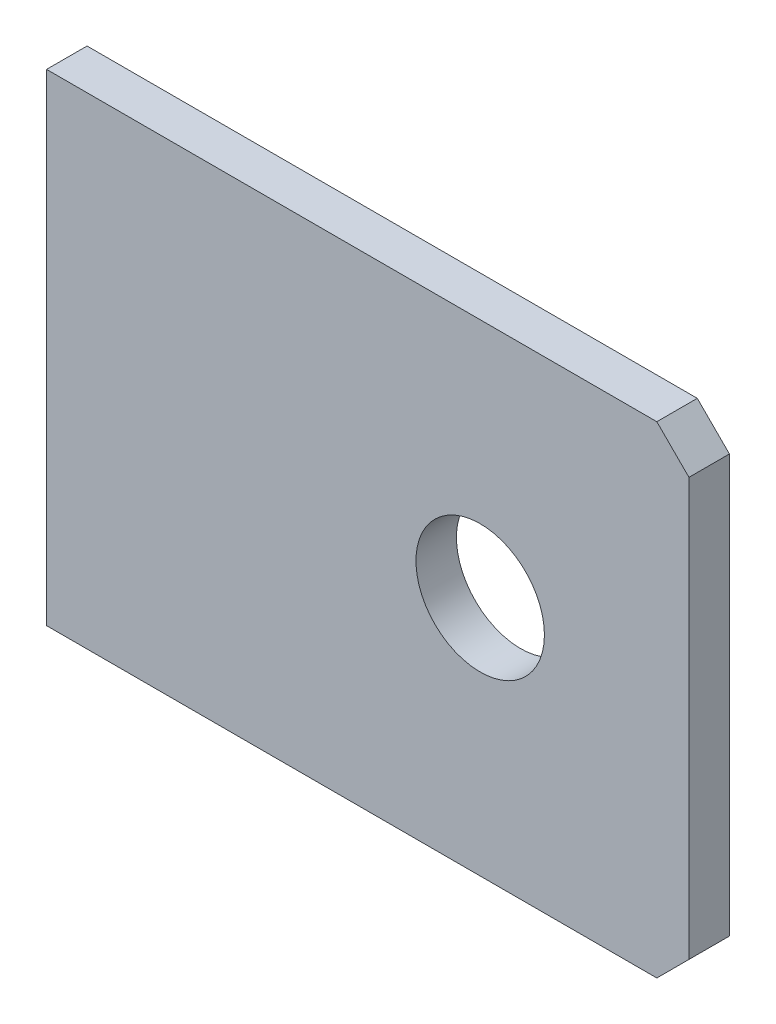
ISO-10303-21;
HEADER;
FILE_DESCRIPTION(('STEP AP214'),'2;1');
FILE_NAME('part.step','',(''),(''),'','','');
FILE_SCHEMA(('AUTOMOTIVE_DESIGN { 1 0 10303 214 1 1 1 1 }'));
ENDSEC;
DATA;
#1=APPLICATION_CONTEXT('core data for automotive mechanical design processes');
#2=APPLICATION_PROTOCOL_DEFINITION('international standard','automotive_design',2000,#1);
#3=PRODUCT_CONTEXT('',#1,'mechanical');
#4=PRODUCT('Part','Part','',(#3));
#5=PRODUCT_RELATED_PRODUCT_CATEGORY('part','',(#4));
#6=PRODUCT_DEFINITION_FORMATION('','',#4);
#7=PRODUCT_DEFINITION_CONTEXT('part definition',#1,'design');
#8=PRODUCT_DEFINITION('design','',#6,#7);
#9=PRODUCT_DEFINITION_SHAPE('','',#8);
#10=(LENGTH_UNIT() NAMED_UNIT(*) SI_UNIT(.MILLI.,.METRE.));
#11=(NAMED_UNIT(*) PLANE_ANGLE_UNIT() SI_UNIT($,.RADIAN.));
#12=(NAMED_UNIT(*) SI_UNIT($,.STERADIAN.) SOLID_ANGLE_UNIT());
#13=UNCERTAINTY_MEASURE_WITH_UNIT(LENGTH_MEASURE(1.E-05),#10,'distance_accuracy_value','');
#14=(GEOMETRIC_REPRESENTATION_CONTEXT(3) GLOBAL_UNCERTAINTY_ASSIGNED_CONTEXT((#13)) GLOBAL_UNIT_ASSIGNED_CONTEXT((#10,
#11,#12)) REPRESENTATION_CONTEXT('',''));
#15=CARTESIAN_POINT('',(0.,0.,0.));
#16=DIRECTION('',(0.,0.,1.));
#17=DIRECTION('',(1.,0.,0.));
#18=AXIS2_PLACEMENT_3D('',#15,#16,#17);
#19=CARTESIAN_POINT('',(0.,0.,1.26));
#20=DIRECTION('',(0.,0.,1.));
#21=DIRECTION('',(1.,0.,0.));
#22=AXIS2_PLACEMENT_3D('',#19,#20,#21);
#23=PLANE('',#22);
#24=DIRECTION('',(0.707106781186543,0.707106781186552,0.));
#25=VECTOR('',#24,1.);
#26=CARTESIAN_POINT('',(9.00000000000002,-7.5,1.26));
#27=LINE('',#26,#25);
#28=CARTESIAN_POINT('',(9.00000000000002,-7.5,1.26));
#29=VERTEX_POINT('',#28);
#30=CARTESIAN_POINT('',(10.,-6.5,1.26));
#31=VERTEX_POINT('',#30);
#32=EDGE_CURVE('E139',#29,#31,#27,.T.);
#33=ORIENTED_EDGE('',*,*,#32,.T.);
#34=DIRECTION('',(0.,1.,0.));
#35=VECTOR('',#34,1.);
#36=CARTESIAN_POINT('',(10.,-6.5,1.26));
#37=LINE('',#36,#35);
#38=CARTESIAN_POINT('',(10.,6.5,1.26));
#39=VERTEX_POINT('',#38);
#40=EDGE_CURVE('E97',#31,#39,#37,.T.);
#41=ORIENTED_EDGE('',*,*,#40,.T.);
#42=DIRECTION('',(-0.707106781186543,0.707106781186552,0.));
#43=VECTOR('',#42,1.);
#44=CARTESIAN_POINT('',(10.,6.5,1.26));
#45=LINE('',#44,#43);
#46=CARTESIAN_POINT('',(9.00000000000002,7.5,1.26));
#47=VERTEX_POINT('',#46);
#48=EDGE_CURVE('E110',#39,#47,#45,.T.);
#49=ORIENTED_EDGE('',*,*,#48,.T.);
#50=DIRECTION('',(-1.,0.,0.));
#51=VECTOR('',#50,1.);
#52=CARTESIAN_POINT('',(9.00000000000002,7.5,1.26));
#53=LINE('',#52,#51);
#54=CARTESIAN_POINT('',(-10.,7.5,1.26));
#55=VERTEX_POINT('',#54);
#56=EDGE_CURVE('E104',#47,#55,#53,.T.);
#57=ORIENTED_EDGE('',*,*,#56,.T.);
#58=DIRECTION('',(0.,-1.,0.));
#59=VECTOR('',#58,1.);
#60=CARTESIAN_POINT('',(-10.,7.5,1.26));
#61=LINE('',#60,#59);
#62=CARTESIAN_POINT('',(-10.,-7.5,1.26));
#63=VERTEX_POINT('',#62);
#64=EDGE_CURVE('E108',#55,#63,#61,.T.);
#65=ORIENTED_EDGE('',*,*,#64,.T.);
#66=DIRECTION('',(1.,0.,0.));
#67=VECTOR('',#66,1.);
#68=CARTESIAN_POINT('',(-10.,-7.5,1.26));
#69=LINE('',#68,#67);
#70=EDGE_CURVE('E60',#63,#29,#69,.T.);
#71=ORIENTED_EDGE('',*,*,#70,.T.);
#72=EDGE_LOOP('',(#33,#41,#49,#57,#65,#71));
#73=FACE_BOUND('',#72,.T.);
#74=CARTESIAN_POINT('',(3.5,0.,1.26));
#75=DIRECTION('',(0.,0.,1.));
#76=DIRECTION('',(1.,0.,0.));
#77=AXIS2_PLACEMENT_3D('',#74,#75,#76);
#78=CIRCLE('',#77,2.);
#79=CARTESIAN_POINT('',(5.50000000000001,0.,1.26));
#80=VERTEX_POINT('',#79);
#81=EDGE_CURVE('E132',#80,#80,#78,.T.);
#82=ORIENTED_EDGE('',*,*,#81,.F.);
#83=EDGE_LOOP('',(#82));
#84=FACE_BOUND('',#83,.T.);
#85=ADVANCED_FACE('F43',(#73,#84),#23,.T.);
#86=CARTESIAN_POINT('',(0.,0.,0.));
#87=DIRECTION('',(0.,0.,1.));
#88=DIRECTION('',(1.,0.,0.));
#89=AXIS2_PLACEMENT_3D('',#86,#87,#88);
#90=PLANE('',#89);
#91=DIRECTION('',(0.707106781186543,0.707106781186552,0.));
#92=VECTOR('',#91,1.);
#93=CARTESIAN_POINT('',(9.00000000000002,-7.5,0.));
#94=LINE('',#93,#92);
#95=CARTESIAN_POINT('',(9.00000000000002,-7.5,0.));
#96=VERTEX_POINT('',#95);
#97=CARTESIAN_POINT('',(10.,-6.5,0.));
#98=VERTEX_POINT('',#97);
#99=EDGE_CURVE('E128',#96,#98,#94,.T.);
#100=ORIENTED_EDGE('',*,*,#99,.F.);
#101=DIRECTION('',(1.,0.,0.));
#102=VECTOR('',#101,1.);
#103=CARTESIAN_POINT('',(-10.,-7.5,0.));
#104=LINE('',#103,#102);
#105=CARTESIAN_POINT('',(-10.,-7.5,0.));
#106=VERTEX_POINT('',#105);
#107=EDGE_CURVE('E89',#106,#96,#104,.T.);
#108=ORIENTED_EDGE('',*,*,#107,.F.);
#109=DIRECTION('',(0.,-1.,0.));
#110=VECTOR('',#109,1.);
#111=CARTESIAN_POINT('',(-10.,7.5,0.));
#112=LINE('',#111,#110);
#113=CARTESIAN_POINT('',(-10.,7.5,0.));
#114=VERTEX_POINT('',#113);
#115=EDGE_CURVE('E83',#114,#106,#112,.T.);
#116=ORIENTED_EDGE('',*,*,#115,.F.);
#117=DIRECTION('',(-1.,0.,0.));
#118=VECTOR('',#117,1.);
#119=CARTESIAN_POINT('',(9.00000000000002,7.5,0.));
#120=LINE('',#119,#118);
#121=CARTESIAN_POINT('',(9.00000000000002,7.5,0.));
#122=VERTEX_POINT('',#121);
#123=EDGE_CURVE('E118',#122,#114,#120,.T.);
#124=ORIENTED_EDGE('',*,*,#123,.F.);
#125=DIRECTION('',(-0.707106781186543,0.707106781186552,0.));
#126=VECTOR('',#125,1.);
#127=CARTESIAN_POINT('',(10.,6.5,0.));
#128=LINE('',#127,#126);
#129=CARTESIAN_POINT('',(10.,6.5,0.));
#130=VERTEX_POINT('',#129);
#131=EDGE_CURVE('E134',#130,#122,#128,.T.);
#132=ORIENTED_EDGE('',*,*,#131,.F.);
#133=DIRECTION('',(0.,1.,0.));
#134=VECTOR('',#133,1.);
#135=CARTESIAN_POINT('',(10.,-6.5,0.));
#136=LINE('',#135,#134);
#137=EDGE_CURVE('E131',#98,#130,#136,.T.);
#138=ORIENTED_EDGE('',*,*,#137,.F.);
#139=EDGE_LOOP('',(#100,#108,#116,#124,#132,#138));
#140=FACE_BOUND('',#139,.T.);
#141=CARTESIAN_POINT('',(3.5,0.,0.));
#142=DIRECTION('',(0.,0.,1.));
#143=DIRECTION('',(1.,0.,0.));
#144=AXIS2_PLACEMENT_3D('',#141,#142,#143);
#145=CIRCLE('',#144,2.);
#146=CARTESIAN_POINT('',(5.50000000000001,0.,0.));
#147=VERTEX_POINT('',#146);
#148=EDGE_CURVE('E268',#147,#147,#145,.T.);
#149=ORIENTED_EDGE('',*,*,#148,.T.);
#150=EDGE_LOOP('',(#149));
#151=FACE_BOUND('',#150,.T.);
#152=ADVANCED_FACE('F148',(#140,#151),#90,.F.);
#153=CARTESIAN_POINT('',(9.00000000000002,-7.5,1.26));
#154=DIRECTION('',(-0.707106781186552,0.707106781186543,0.));
#155=DIRECTION('',(-0.707106781186543,-0.707106781186552,0.));
#156=AXIS2_PLACEMENT_3D('',#153,#154,#155);
#157=PLANE('',#156);
#158=ORIENTED_EDGE('',*,*,#99,.T.);
#159=DIRECTION('',(0.,0.,-1.));
#160=VECTOR('',#159,1.);
#161=CARTESIAN_POINT('',(10.,-6.5,1.26));
#162=LINE('',#161,#160);
#163=EDGE_CURVE('E11',#31,#98,#162,.T.);
#164=ORIENTED_EDGE('',*,*,#163,.F.);
#165=ORIENTED_EDGE('',*,*,#32,.F.);
#166=DIRECTION('',(0.,0.,-1.));
#167=VECTOR('',#166,1.);
#168=CARTESIAN_POINT('',(9.00000000000002,-7.5,1.26));
#169=LINE('',#168,#167);
#170=EDGE_CURVE('E124',#29,#96,#169,.T.);
#171=ORIENTED_EDGE('',*,*,#170,.T.);
#172=EDGE_LOOP('',(#158,#164,#165,#171));
#173=FACE_BOUND('',#172,.T.);
#174=ADVANCED_FACE('F45',(#173),#157,.F.);
#175=CARTESIAN_POINT('',(10.,-6.5,1.26));
#176=DIRECTION('',(-1.,0.,0.));
#177=DIRECTION('',(0.,0.,1.));
#178=AXIS2_PLACEMENT_3D('',#175,#176,#177);
#179=PLANE('',#178);
#180=ORIENTED_EDGE('',*,*,#137,.T.);
#181=DIRECTION('',(0.,0.,-1.));
#182=VECTOR('',#181,1.);
#183=CARTESIAN_POINT('',(10.,6.5,1.26));
#184=LINE('',#183,#182);
#185=EDGE_CURVE('E52',#39,#130,#184,.T.);
#186=ORIENTED_EDGE('',*,*,#185,.F.);
#187=ORIENTED_EDGE('',*,*,#40,.F.);
#188=ORIENTED_EDGE('',*,*,#163,.T.);
#189=EDGE_LOOP('',(#180,#186,#187,#188));
#190=FACE_BOUND('',#189,.T.);
#191=ADVANCED_FACE('F173',(#190),#179,.F.);
#192=CARTESIAN_POINT('',(10.,6.5,1.26));
#193=DIRECTION('',(-0.707106781186552,-0.707106781186543,0.));
#194=DIRECTION('',(0.707106781186543,-0.707106781186552,0.));
#195=AXIS2_PLACEMENT_3D('',#192,#193,#194);
#196=PLANE('',#195);
#197=ORIENTED_EDGE('',*,*,#131,.T.);
#198=DIRECTION('',(0.,0.,-1.));
#199=VECTOR('',#198,1.);
#200=CARTESIAN_POINT('',(9.00000000000002,7.5,1.26));
#201=LINE('',#200,#199);
#202=EDGE_CURVE('E119',#47,#122,#201,.T.);
#203=ORIENTED_EDGE('',*,*,#202,.F.);
#204=ORIENTED_EDGE('',*,*,#48,.F.);
#205=ORIENTED_EDGE('',*,*,#185,.T.);
#206=EDGE_LOOP('',(#197,#203,#204,#205));
#207=FACE_BOUND('',#206,.T.);
#208=ADVANCED_FACE('F145',(#207),#196,.F.);
#209=CARTESIAN_POINT('',(9.00000000000002,7.5,1.26));
#210=DIRECTION('',(0.,-1.,0.));
#211=DIRECTION('',(0.,0.,-1.));
#212=AXIS2_PLACEMENT_3D('',#209,#210,#211);
#213=PLANE('',#212);
#214=ORIENTED_EDGE('',*,*,#123,.T.);
#215=DIRECTION('',(0.,0.,-1.));
#216=VECTOR('',#215,1.);
#217=CARTESIAN_POINT('',(-10.,7.5,1.26));
#218=LINE('',#217,#216);
#219=EDGE_CURVE('E115',#55,#114,#218,.T.);
#220=ORIENTED_EDGE('',*,*,#219,.F.);
#221=ORIENTED_EDGE('',*,*,#56,.F.);
#222=ORIENTED_EDGE('',*,*,#202,.T.);
#223=EDGE_LOOP('',(#214,#220,#221,#222));
#224=FACE_BOUND('',#223,.T.);
#225=ADVANCED_FACE('F116',(#224),#213,.F.);
#226=CARTESIAN_POINT('',(-10.,7.5,1.26));
#227=DIRECTION('',(1.,0.,0.));
#228=DIRECTION('',(0.,0.,-1.));
#229=AXIS2_PLACEMENT_3D('',#226,#227,#228);
#230=PLANE('',#229);
#231=ORIENTED_EDGE('',*,*,#115,.T.);
#232=DIRECTION('',(0.,0.,-1.));
#233=VECTOR('',#232,1.);
#234=CARTESIAN_POINT('',(-10.,-7.5,1.26));
#235=LINE('',#234,#233);
#236=EDGE_CURVE('E120',#63,#106,#235,.T.);
#237=ORIENTED_EDGE('',*,*,#236,.F.);
#238=ORIENTED_EDGE('',*,*,#64,.F.);
#239=ORIENTED_EDGE('',*,*,#219,.T.);
#240=EDGE_LOOP('',(#231,#237,#238,#239));
#241=FACE_BOUND('',#240,.T.);
#242=ADVANCED_FACE('F122',(#241),#230,.F.);
#243=CARTESIAN_POINT('',(-10.,-7.5,1.26));
#244=DIRECTION('',(0.,1.,0.));
#245=DIRECTION('',(0.,0.,1.));
#246=AXIS2_PLACEMENT_3D('',#243,#244,#245);
#247=PLANE('',#246);
#248=ORIENTED_EDGE('',*,*,#107,.T.);
#249=ORIENTED_EDGE('',*,*,#170,.F.);
#250=ORIENTED_EDGE('',*,*,#70,.F.);
#251=ORIENTED_EDGE('',*,*,#236,.T.);
#252=EDGE_LOOP('',(#248,#249,#250,#251));
#253=FACE_BOUND('',#252,.T.);
#254=ADVANCED_FACE('F153',(#253),#247,.F.);
#255=CARTESIAN_POINT('',(3.5,0.,1.26));
#256=DIRECTION('',(0.,0.,-1.));
#257=DIRECTION('',(-1.,0.,0.));
#258=AXIS2_PLACEMENT_3D('',#255,#256,#257);
#259=CYLINDRICAL_SURFACE('',#258,2.);
#260=ORIENTED_EDGE('',*,*,#81,.T.);
#261=EDGE_LOOP('',(#260));
#262=FACE_BOUND('',#261,.T.);
#263=ORIENTED_EDGE('',*,*,#148,.F.);
#264=EDGE_LOOP('',(#263));
#265=FACE_BOUND('',#264,.T.);
#266=ADVANCED_FACE('F155',(#262,#265),#259,.F.);
#267=CLOSED_SHELL('',(#85,#152,#174,#191,#208,#225,#242,#254,#266));
#268=MANIFOLD_SOLID_BREP('B2',#267);
#269=ADVANCED_BREP_SHAPE_REPRESENTATION('',(#18,#268),#14);
#270=SHAPE_DEFINITION_REPRESENTATION(#9,#269);
ENDSEC;
END-ISO-10303-21;
